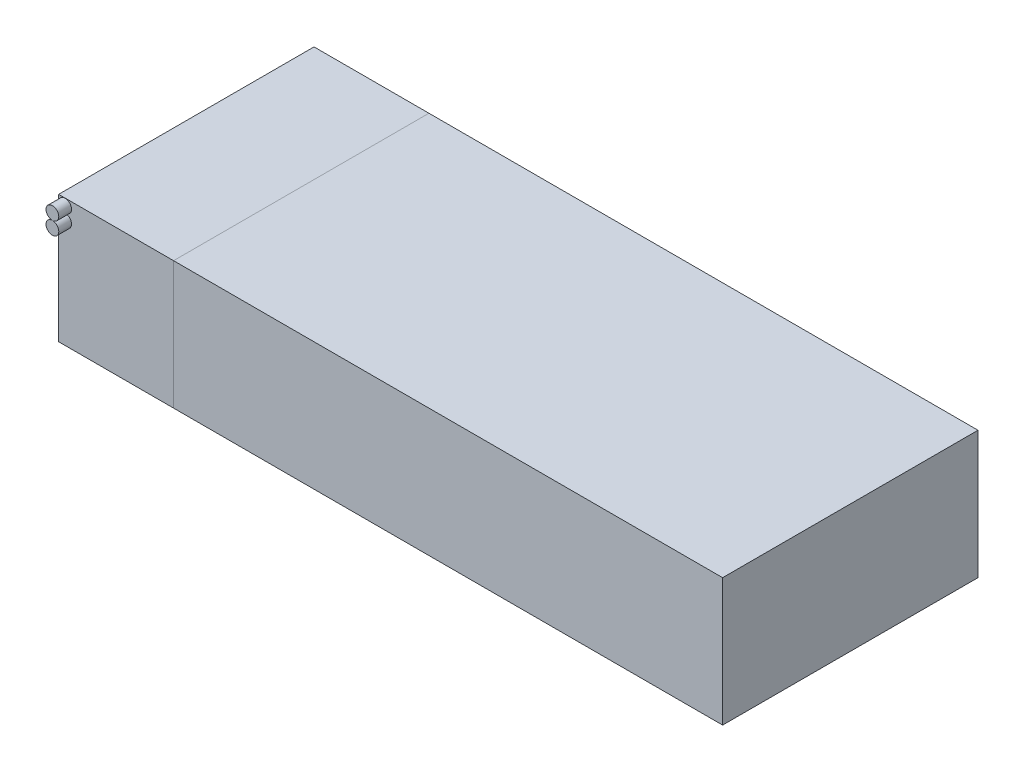
ISO-10303-21;
HEADER;
FILE_DESCRIPTION(('STEP AP214'),'2;1');
FILE_NAME('part.step','',(''),(''),'','','');
FILE_SCHEMA(('AUTOMOTIVE_DESIGN { 1 0 10303 214 1 1 1 1 }'));
ENDSEC;
DATA;
#1=APPLICATION_CONTEXT('core data for automotive mechanical design processes');
#2=APPLICATION_PROTOCOL_DEFINITION('international standard','automotive_design',2000,#1);
#3=PRODUCT_CONTEXT('',#1,'mechanical');
#4=PRODUCT('Part','Part','',(#3));
#5=PRODUCT_RELATED_PRODUCT_CATEGORY('part','',(#4));
#6=PRODUCT_DEFINITION_FORMATION('','',#4);
#7=PRODUCT_DEFINITION_CONTEXT('part definition',#1,'design');
#8=PRODUCT_DEFINITION('design','',#6,#7);
#9=PRODUCT_DEFINITION_SHAPE('','',#8);
#10=(LENGTH_UNIT() NAMED_UNIT(*) SI_UNIT(.MILLI.,.METRE.));
#11=(NAMED_UNIT(*) PLANE_ANGLE_UNIT() SI_UNIT($,.RADIAN.));
#12=(NAMED_UNIT(*) SI_UNIT($,.STERADIAN.) SOLID_ANGLE_UNIT());
#13=UNCERTAINTY_MEASURE_WITH_UNIT(LENGTH_MEASURE(1.E-05),#10,'distance_accuracy_value','');
#14=(GEOMETRIC_REPRESENTATION_CONTEXT(3) GLOBAL_UNCERTAINTY_ASSIGNED_CONTEXT((#13)) GLOBAL_UNIT_ASSIGNED_CONTEXT((#10,
#11,#12)) REPRESENTATION_CONTEXT('',''));
#15=CARTESIAN_POINT('',(0.,0.,0.));
#16=DIRECTION('',(0.,0.,1.));
#17=DIRECTION('',(1.,0.,0.));
#18=AXIS2_PLACEMENT_3D('',#15,#16,#17);
#19=CARTESIAN_POINT('',(0.,10.,0.));
#20=DIRECTION('',(0.,0.,-1.));
#21=DIRECTION('',(-1.,0.,0.));
#22=AXIS2_PLACEMENT_3D('',#19,#20,#21);
#23=PLANE('',#22);
#24=CARTESIAN_POINT('',(0.510000000000004,8.48,0.));
#25=DIRECTION('',(0.,0.,-1.));
#26=DIRECTION('',(-1.,0.,0.));
#27=AXIS2_PLACEMENT_3D('',#24,#25,#26);
#28=CIRCLE('',#27,0.5);
#29=CARTESIAN_POINT('',(0.0100000000000031,8.48,0.));
#30=VERTEX_POINT('',#29);
#31=EDGE_CURVE('E11',#30,#30,#28,.F.);
#32=ORIENTED_EDGE('',*,*,#31,.F.);
#33=EDGE_LOOP('',(#32));
#34=FACE_BOUND('',#33,.T.);
#35=CARTESIAN_POINT('',(0.509999999999968,9.49,0.));
#36=DIRECTION('',(0.,0.,-1.));
#37=DIRECTION('',(-1.,0.,0.));
#38=AXIS2_PLACEMENT_3D('',#35,#36,#37);
#39=CIRCLE('',#38,0.500000000000001);
#40=CARTESIAN_POINT('',(0.00999999999996707,9.49,0.));
#41=VERTEX_POINT('',#40);
#42=EDGE_CURVE('E64',#41,#41,#39,.F.);
#43=ORIENTED_EDGE('',*,*,#42,.F.);
#44=EDGE_LOOP('',(#43));
#45=FACE_BOUND('',#44,.T.);
#46=DIRECTION('',(0.,-1.,0.));
#47=VECTOR('',#46,1.);
#48=CARTESIAN_POINT('',(9.,10.,0.));
#49=LINE('',#48,#47);
#50=CARTESIAN_POINT('',(9.,10.,0.));
#51=VERTEX_POINT('',#50);
#52=CARTESIAN_POINT('',(9.,0.,0.));
#53=VERTEX_POINT('',#52);
#54=EDGE_CURVE('E71',#51,#53,#49,.T.);
#55=ORIENTED_EDGE('',*,*,#54,.F.);
#56=DIRECTION('',(1.,0.,0.));
#57=VECTOR('',#56,1.);
#58=CARTESIAN_POINT('',(0.,10.,0.));
#59=LINE('',#58,#57);
#60=CARTESIAN_POINT('',(0.,10.,0.));
#61=VERTEX_POINT('',#60);
#62=EDGE_CURVE('E107',#61,#51,#59,.T.);
#63=ORIENTED_EDGE('',*,*,#62,.F.);
#64=DIRECTION('',(0.,-1.,0.));
#65=VECTOR('',#64,1.);
#66=CARTESIAN_POINT('',(0.,10.,0.));
#67=LINE('',#66,#65);
#68=CARTESIAN_POINT('',(0.,0.,0.));
#69=VERTEX_POINT('',#68);
#70=EDGE_CURVE('E110',#61,#69,#67,.T.);
#71=ORIENTED_EDGE('',*,*,#70,.T.);
#72=DIRECTION('',(1.,0.,0.));
#73=VECTOR('',#72,1.);
#74=CARTESIAN_POINT('',(0.,0.,0.));
#75=LINE('',#74,#73);
#76=EDGE_CURVE('E193',#69,#53,#75,.T.);
#77=ORIENTED_EDGE('',*,*,#76,.T.);
#78=EDGE_LOOP('',(#55,#63,#71,#77));
#79=FACE_BOUND('',#78,.T.);
#80=ADVANCED_FACE('F55',(#34,#45,#79),#23,.F.);
#81=CARTESIAN_POINT('',(0.,10.,0.));
#82=DIRECTION('',(0.,-1.,0.));
#83=DIRECTION('',(0.,0.,-1.));
#84=AXIS2_PLACEMENT_3D('',#81,#82,#83);
#85=PLANE('',#84);
#86=DIRECTION('',(0.,0.,1.));
#87=VECTOR('',#86,1.);
#88=CARTESIAN_POINT('',(9.,10.,0.));
#89=LINE('',#88,#87);
#90=CARTESIAN_POINT('',(9.,10.,-20.));
#91=VERTEX_POINT('',#90);
#92=EDGE_CURVE('E78',#91,#51,#89,.T.);
#93=ORIENTED_EDGE('',*,*,#92,.F.);
#94=DIRECTION('',(-1.,0.,0.));
#95=VECTOR('',#94,1.);
#96=CARTESIAN_POINT('',(0.,10.,-20.));
#97=LINE('',#96,#95);
#98=CARTESIAN_POINT('',(0.,10.,-20.));
#99=VERTEX_POINT('',#98);
#100=EDGE_CURVE('E120',#91,#99,#97,.T.);
#101=ORIENTED_EDGE('',*,*,#100,.T.);
#102=DIRECTION('',(0.,0.,1.));
#103=VECTOR('',#102,1.);
#104=CARTESIAN_POINT('',(0.,10.,0.));
#105=LINE('',#104,#103);
#106=EDGE_CURVE('E117',#99,#61,#105,.T.);
#107=ORIENTED_EDGE('',*,*,#106,.T.);
#108=ORIENTED_EDGE('',*,*,#62,.T.);
#109=EDGE_LOOP('',(#93,#101,#107,#108));
#110=FACE_BOUND('',#109,.T.);
#111=ADVANCED_FACE('F118',(#110),#85,.F.);
#112=CARTESIAN_POINT('',(0.,10.,-20.));
#113=DIRECTION('',(0.,0.,1.));
#114=DIRECTION('',(1.,0.,0.));
#115=AXIS2_PLACEMENT_3D('',#112,#113,#114);
#116=PLANE('',#115);
#117=DIRECTION('',(0.,1.,0.));
#118=VECTOR('',#117,1.);
#119=CARTESIAN_POINT('',(9.,10.,-20.));
#120=LINE('',#119,#118);
#121=CARTESIAN_POINT('',(9.,0.,-20.));
#122=VERTEX_POINT('',#121);
#123=EDGE_CURVE('E136',#122,#91,#120,.T.);
#124=ORIENTED_EDGE('',*,*,#123,.F.);
#125=DIRECTION('',(-1.,0.,0.));
#126=VECTOR('',#125,1.);
#127=CARTESIAN_POINT('',(0.,0.,-20.));
#128=LINE('',#127,#126);
#129=CARTESIAN_POINT('',(0.,0.,-20.));
#130=VERTEX_POINT('',#129);
#131=EDGE_CURVE('E199',#122,#130,#128,.T.);
#132=ORIENTED_EDGE('',*,*,#131,.T.);
#133=DIRECTION('',(0.,-1.,0.));
#134=VECTOR('',#133,1.);
#135=CARTESIAN_POINT('',(0.,10.,-20.));
#136=LINE('',#135,#134);
#137=EDGE_CURVE('E188',#99,#130,#136,.T.);
#138=ORIENTED_EDGE('',*,*,#137,.F.);
#139=ORIENTED_EDGE('',*,*,#100,.F.);
#140=EDGE_LOOP('',(#124,#132,#138,#139));
#141=FACE_BOUND('',#140,.T.);
#142=ADVANCED_FACE('F160',(#141),#116,.F.);
#143=CARTESIAN_POINT('',(0.,0.,0.));
#144=DIRECTION('',(0.,-1.,0.));
#145=DIRECTION('',(0.,0.,-1.));
#146=AXIS2_PLACEMENT_3D('',#143,#144,#145);
#147=PLANE('',#146);
#148=ORIENTED_EDGE('',*,*,#131,.F.);
#149=DIRECTION('',(0.,0.,1.));
#150=VECTOR('',#149,1.);
#151=CARTESIAN_POINT('',(9.,0.,0.));
#152=LINE('',#151,#150);
#153=EDGE_CURVE('E130',#122,#53,#152,.T.);
#154=ORIENTED_EDGE('',*,*,#153,.T.);
#155=ORIENTED_EDGE('',*,*,#76,.F.);
#156=DIRECTION('',(0.,0.,1.));
#157=VECTOR('',#156,1.);
#158=CARTESIAN_POINT('',(0.,0.,0.));
#159=LINE('',#158,#157);
#160=EDGE_CURVE('E128',#130,#69,#159,.T.);
#161=ORIENTED_EDGE('',*,*,#160,.F.);
#162=EDGE_LOOP('',(#148,#154,#155,#161));
#163=FACE_BOUND('',#162,.T.);
#164=ADVANCED_FACE('F174',(#163),#147,.T.);
#165=CARTESIAN_POINT('',(0.,10.,0.));
#166=DIRECTION('',(1.,0.,0.));
#167=DIRECTION('',(0.,0.,-1.));
#168=AXIS2_PLACEMENT_3D('',#165,#166,#167);
#169=PLANE('',#168);
#170=ORIENTED_EDGE('',*,*,#160,.T.);
#171=ORIENTED_EDGE('',*,*,#70,.F.);
#172=ORIENTED_EDGE('',*,*,#106,.F.);
#173=ORIENTED_EDGE('',*,*,#137,.T.);
#174=EDGE_LOOP('',(#170,#171,#172,#173));
#175=FACE_BOUND('',#174,.T.);
#176=ADVANCED_FACE('F57',(#175),#169,.F.);
#177=CARTESIAN_POINT('',(52.,10.,0.));
#178=VERTEX_POINT('',#177);
#179=EDGE_CURVE('E114',#51,#178,#59,.T.);
#180=ORIENTED_EDGE('',*,*,#179,.F.);
#181=ORIENTED_EDGE('',*,*,#54,.T.);
#182=CARTESIAN_POINT('',(52.,0.,0.));
#183=VERTEX_POINT('',#182);
#184=EDGE_CURVE('E191',#53,#183,#75,.T.);
#185=ORIENTED_EDGE('',*,*,#184,.T.);
#186=DIRECTION('',(0.,-1.,0.));
#187=VECTOR('',#186,1.);
#188=CARTESIAN_POINT('',(52.,10.,0.));
#189=LINE('',#188,#187);
#190=EDGE_CURVE('E131',#178,#183,#189,.T.);
#191=ORIENTED_EDGE('',*,*,#190,.F.);
#192=EDGE_LOOP('',(#180,#181,#185,#191));
#193=FACE_BOUND('',#192,.T.);
#194=ADVANCED_FACE('F156',(#193),#23,.F.);
#195=CARTESIAN_POINT('',(52.,10.,0.));
#196=DIRECTION('',(-1.,0.,0.));
#197=DIRECTION('',(0.,0.,1.));
#198=AXIS2_PLACEMENT_3D('',#195,#196,#197);
#199=PLANE('',#198);
#200=DIRECTION('',(0.,0.,-1.));
#201=VECTOR('',#200,1.);
#202=CARTESIAN_POINT('',(52.,0.,0.));
#203=LINE('',#202,#201);
#204=CARTESIAN_POINT('',(52.,0.,-20.));
#205=VERTEX_POINT('',#204);
#206=EDGE_CURVE('E196',#183,#205,#203,.T.);
#207=ORIENTED_EDGE('',*,*,#206,.T.);
#208=DIRECTION('',(0.,-1.,0.));
#209=VECTOR('',#208,1.);
#210=CARTESIAN_POINT('',(52.,10.,-20.));
#211=LINE('',#210,#209);
#212=CARTESIAN_POINT('',(52.,10.,-20.));
#213=VERTEX_POINT('',#212);
#214=EDGE_CURVE('E139',#213,#205,#211,.T.);
#215=ORIENTED_EDGE('',*,*,#214,.F.);
#216=DIRECTION('',(0.,0.,-1.));
#217=VECTOR('',#216,1.);
#218=CARTESIAN_POINT('',(52.,10.,0.));
#219=LINE('',#218,#217);
#220=EDGE_CURVE('E113',#178,#213,#219,.T.);
#221=ORIENTED_EDGE('',*,*,#220,.F.);
#222=ORIENTED_EDGE('',*,*,#190,.T.);
#223=EDGE_LOOP('',(#207,#215,#221,#222));
#224=FACE_BOUND('',#223,.T.);
#225=ADVANCED_FACE('F166',(#224),#199,.F.);
#226=EDGE_CURVE('E125',#205,#122,#128,.T.);
#227=ORIENTED_EDGE('',*,*,#226,.T.);
#228=ORIENTED_EDGE('',*,*,#123,.T.);
#229=EDGE_CURVE('E184',#213,#91,#97,.T.);
#230=ORIENTED_EDGE('',*,*,#229,.F.);
#231=ORIENTED_EDGE('',*,*,#214,.T.);
#232=EDGE_LOOP('',(#227,#228,#230,#231));
#233=FACE_BOUND('',#232,.T.);
#234=ADVANCED_FACE('F172',(#233),#116,.F.);
#235=ORIENTED_EDGE('',*,*,#229,.T.);
#236=ORIENTED_EDGE('',*,*,#92,.T.);
#237=ORIENTED_EDGE('',*,*,#179,.T.);
#238=ORIENTED_EDGE('',*,*,#220,.T.);
#239=EDGE_LOOP('',(#235,#236,#237,#238));
#240=FACE_BOUND('',#239,.T.);
#241=ADVANCED_FACE('F162',(#240),#85,.F.);
#242=ORIENTED_EDGE('',*,*,#153,.F.);
#243=ORIENTED_EDGE('',*,*,#226,.F.);
#244=ORIENTED_EDGE('',*,*,#206,.F.);
#245=ORIENTED_EDGE('',*,*,#184,.F.);
#246=EDGE_LOOP('',(#242,#243,#244,#245));
#247=FACE_BOUND('',#246,.T.);
#248=ADVANCED_FACE('F213',(#247),#147,.T.);
#249=CARTESIAN_POINT('',(0.509999999999968,9.49,1.));
#250=DIRECTION('',(0.,0.,-1.));
#251=DIRECTION('',(-1.,0.,0.));
#252=AXIS2_PLACEMENT_3D('',#249,#250,#251);
#253=CYLINDRICAL_SURFACE('',#252,0.500000000000001);
#254=CARTESIAN_POINT('',(0.509999999999968,9.49,1.));
#255=DIRECTION('',(0.,0.,1.));
#256=DIRECTION('',(1.,0.,0.));
#257=AXIS2_PLACEMENT_3D('',#254,#255,#256);
#258=CIRCLE('',#257,0.500000000000001);
#259=CARTESIAN_POINT('',(1.00999999999997,9.49,1.));
#260=VERTEX_POINT('',#259);
#261=EDGE_CURVE('E192',#260,#260,#258,.T.);
#262=ORIENTED_EDGE('',*,*,#261,.F.);
#263=EDGE_LOOP('',(#262));
#264=FACE_BOUND('',#263,.T.);
#265=ORIENTED_EDGE('',*,*,#42,.T.);
#266=EDGE_LOOP('',(#265));
#267=FACE_BOUND('',#266,.T.);
#268=ADVANCED_FACE('F152',(#264,#267),#253,.T.);
#269=CARTESIAN_POINT('',(0.,0.,1.));
#270=DIRECTION('',(0.,0.,1.));
#271=DIRECTION('',(1.,0.,0.));
#272=AXIS2_PLACEMENT_3D('',#269,#270,#271);
#273=PLANE('',#272);
#274=ORIENTED_EDGE('',*,*,#261,.T.);
#275=EDGE_LOOP('',(#274));
#276=FACE_BOUND('',#275,.T.);
#277=ADVANCED_FACE('F233',(#276),#273,.T.);
#278=CARTESIAN_POINT('',(0.510000000000004,8.48,1.));
#279=DIRECTION('',(0.,0.,-1.));
#280=DIRECTION('',(-1.,0.,0.));
#281=AXIS2_PLACEMENT_3D('',#278,#279,#280);
#282=CYLINDRICAL_SURFACE('',#281,0.5);
#283=CARTESIAN_POINT('',(0.510000000000004,8.48,1.));
#284=DIRECTION('',(0.,0.,1.));
#285=DIRECTION('',(1.,0.,0.));
#286=AXIS2_PLACEMENT_3D('',#283,#284,#285);
#287=CIRCLE('',#286,0.5);
#288=CARTESIAN_POINT('',(1.01,8.48,1.));
#289=VERTEX_POINT('',#288);
#290=EDGE_CURVE('E223',#289,#289,#287,.T.);
#291=ORIENTED_EDGE('',*,*,#290,.F.);
#292=EDGE_LOOP('',(#291));
#293=FACE_BOUND('',#292,.T.);
#294=ORIENTED_EDGE('',*,*,#31,.T.);
#295=EDGE_LOOP('',(#294));
#296=FACE_BOUND('',#295,.T.);
#297=ADVANCED_FACE('F230',(#293,#296),#282,.T.);
#298=CARTESIAN_POINT('',(0.,0.,1.));
#299=DIRECTION('',(0.,0.,1.));
#300=DIRECTION('',(1.,0.,0.));
#301=AXIS2_PLACEMENT_3D('',#298,#299,#300);
#302=PLANE('',#301);
#303=ORIENTED_EDGE('',*,*,#290,.T.);
#304=EDGE_LOOP('',(#303));
#305=FACE_BOUND('',#304,.T.);
#306=ADVANCED_FACE('F228',(#305),#302,.T.);
#307=CLOSED_SHELL('',(#80,#111,#142,#164,#176,#194,#225,#234,#241,#248,#268,#277,#297,#306));
#308=MANIFOLD_SOLID_BREP('B2',#307);
#309=ADVANCED_BREP_SHAPE_REPRESENTATION('',(#18,#308),#14);
#310=SHAPE_DEFINITION_REPRESENTATION(#9,#309);
ENDSEC;
END-ISO-10303-21;
